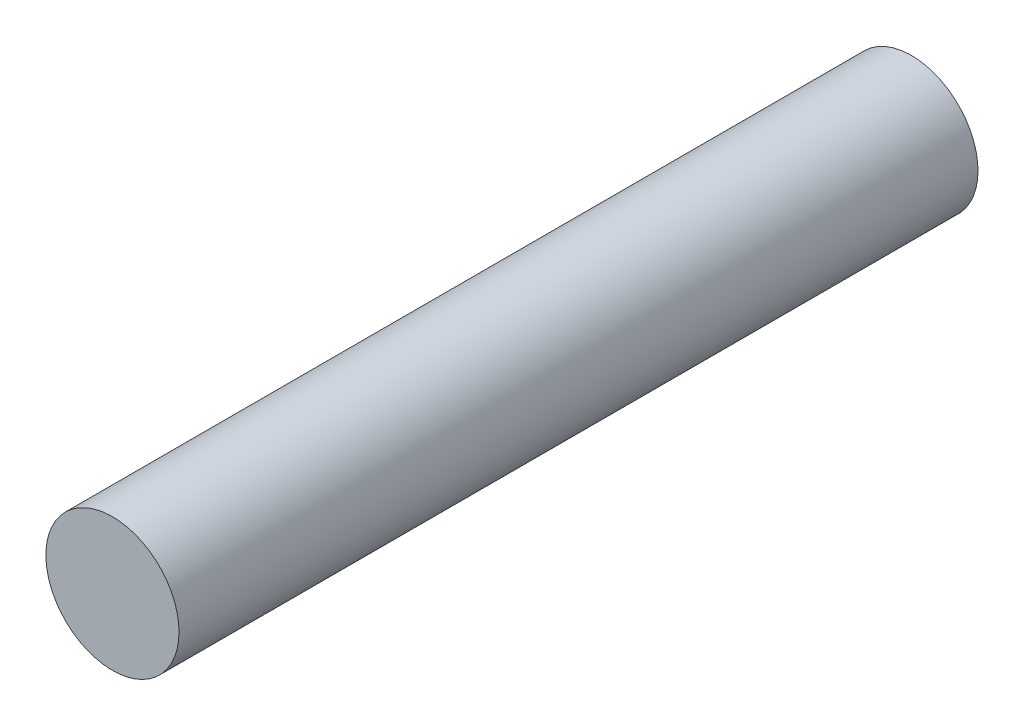
ISO-10303-21;
HEADER;
FILE_DESCRIPTION(('STEP AP214'),'2;1');
FILE_NAME('part.step','',(''),(''),'','','');
FILE_SCHEMA(('AUTOMOTIVE_DESIGN { 1 0 10303 214 1 1 1 1 }'));
ENDSEC;
DATA;
#1=APPLICATION_CONTEXT('core data for automotive mechanical design processes');
#2=APPLICATION_PROTOCOL_DEFINITION('international standard','automotive_design',2000,#1);
#3=PRODUCT_CONTEXT('',#1,'mechanical');
#4=PRODUCT('Part','Part','',(#3));
#5=PRODUCT_RELATED_PRODUCT_CATEGORY('part','',(#4));
#6=PRODUCT_DEFINITION_FORMATION('','',#4);
#7=PRODUCT_DEFINITION_CONTEXT('part definition',#1,'design');
#8=PRODUCT_DEFINITION('design','',#6,#7);
#9=PRODUCT_DEFINITION_SHAPE('','',#8);
#10=(LENGTH_UNIT() NAMED_UNIT(*) SI_UNIT(.MILLI.,.METRE.));
#11=(NAMED_UNIT(*) PLANE_ANGLE_UNIT() SI_UNIT($,.RADIAN.));
#12=(NAMED_UNIT(*) SI_UNIT($,.STERADIAN.) SOLID_ANGLE_UNIT());
#13=UNCERTAINTY_MEASURE_WITH_UNIT(LENGTH_MEASURE(1.E-05),#10,'distance_accuracy_value','');
#14=(GEOMETRIC_REPRESENTATION_CONTEXT(3) GLOBAL_UNCERTAINTY_ASSIGNED_CONTEXT((#13)) GLOBAL_UNIT_ASSIGNED_CONTEXT((#10,
#11,#12)) REPRESENTATION_CONTEXT('',''));
#15=CARTESIAN_POINT('',(0.,0.,0.));
#16=DIRECTION('',(0.,0.,1.));
#17=DIRECTION('',(1.,0.,0.));
#18=AXIS2_PLACEMENT_3D('',#15,#16,#17);
#19=CARTESIAN_POINT('',(0.,0.,-6.));
#20=DIRECTION('',(0.,0.,1.));
#21=DIRECTION('',(1.,0.,0.));
#22=AXIS2_PLACEMENT_3D('',#19,#20,#21);
#23=CYLINDRICAL_SURFACE('',#22,1.);
#24=CARTESIAN_POINT('',(0.,0.,-6.));
#25=DIRECTION('',(0.,0.,1.));
#26=DIRECTION('',(1.,0.,0.));
#27=AXIS2_PLACEMENT_3D('',#24,#25,#26);
#28=CIRCLE('',#27,1.);
#29=CARTESIAN_POINT('',(1.,0.,-6.));
#30=VERTEX_POINT('',#29);
#31=EDGE_CURVE('E10',#30,#30,#28,.T.);
#32=ORIENTED_EDGE('',*,*,#31,.T.);
#33=EDGE_LOOP('',(#32));
#34=FACE_BOUND('',#33,.T.);
#35=CARTESIAN_POINT('',(0.,0.,6.));
#36=DIRECTION('',(0.,0.,1.));
#37=DIRECTION('',(1.,0.,0.));
#38=AXIS2_PLACEMENT_3D('',#35,#36,#37);
#39=CIRCLE('',#38,1.);
#40=CARTESIAN_POINT('',(1.,0.,6.));
#41=VERTEX_POINT('',#40);
#42=EDGE_CURVE('E41',#41,#41,#39,.T.);
#43=ORIENTED_EDGE('',*,*,#42,.F.);
#44=EDGE_LOOP('',(#43));
#45=FACE_BOUND('',#44,.T.);
#46=ADVANCED_FACE('F34',(#34,#45),#23,.T.);
#47=CARTESIAN_POINT('',(0.,0.,-6.));
#48=DIRECTION('',(0.,0.,1.));
#49=DIRECTION('',(1.,0.,0.));
#50=AXIS2_PLACEMENT_3D('',#47,#48,#49);
#51=PLANE('',#50);
#52=ORIENTED_EDGE('',*,*,#31,.F.);
#53=EDGE_LOOP('',(#52));
#54=FACE_BOUND('',#53,.T.);
#55=ADVANCED_FACE('F49',(#54),#51,.F.);
#56=CARTESIAN_POINT('',(0.,0.,6.));
#57=DIRECTION('',(0.,0.,1.));
#58=DIRECTION('',(1.,0.,0.));
#59=AXIS2_PLACEMENT_3D('',#56,#57,#58);
#60=PLANE('',#59);
#61=ORIENTED_EDGE('',*,*,#42,.T.);
#62=EDGE_LOOP('',(#61));
#63=FACE_BOUND('',#62,.T.);
#64=ADVANCED_FACE('F50',(#63),#60,.T.);
#65=CLOSED_SHELL('',(#46,#55,#64));
#66=MANIFOLD_SOLID_BREP('B2',#65);
#67=ADVANCED_BREP_SHAPE_REPRESENTATION('',(#18,#66),#14);
#68=SHAPE_DEFINITION_REPRESENTATION(#9,#67);
ENDSEC;
END-ISO-10303-21;
